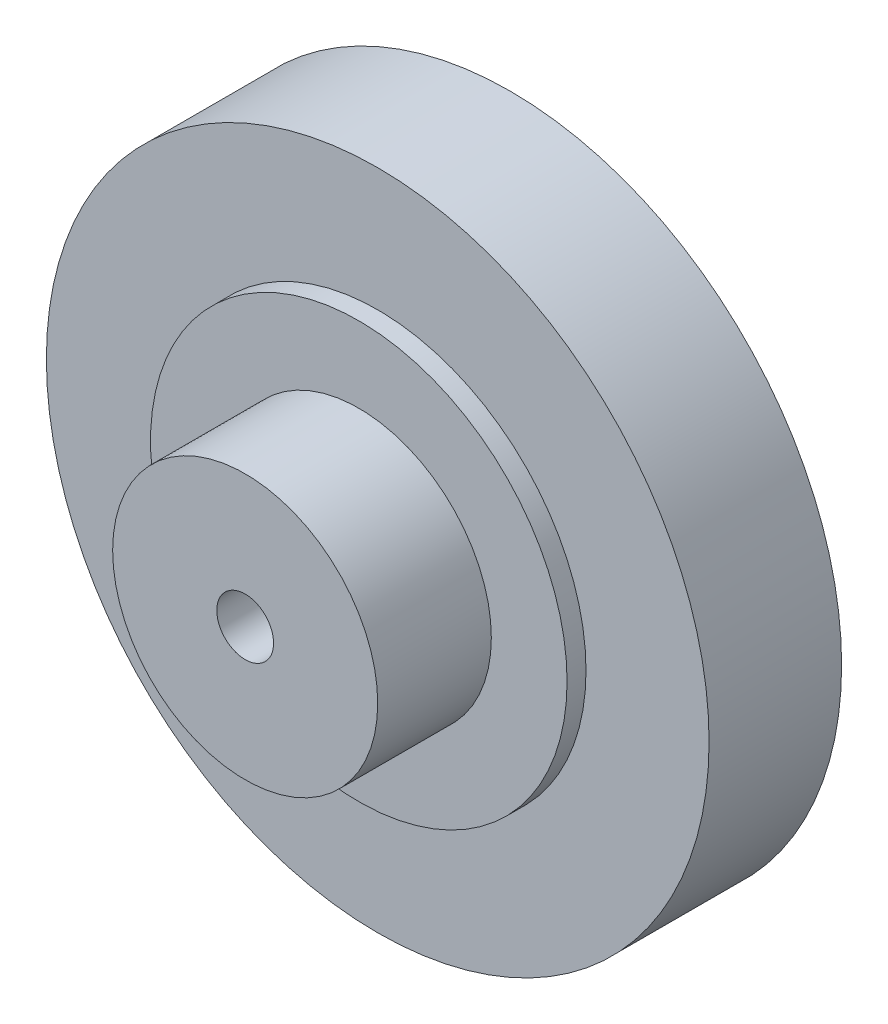
ISO-10303-21;
HEADER;
FILE_DESCRIPTION(('STEP AP214'),'2;1');
FILE_NAME('part.step','',(''),(''),'','','');
FILE_SCHEMA(('AUTOMOTIVE_DESIGN { 1 0 10303 214 1 1 1 1 }'));
ENDSEC;
DATA;
#1=APPLICATION_CONTEXT('core data for automotive mechanical design processes');
#2=APPLICATION_PROTOCOL_DEFINITION('international standard','automotive_design',2000,#1);
#3=PRODUCT_CONTEXT('',#1,'mechanical');
#4=PRODUCT('Part','Part','',(#3));
#5=PRODUCT_RELATED_PRODUCT_CATEGORY('part','',(#4));
#6=PRODUCT_DEFINITION_FORMATION('','',#4);
#7=PRODUCT_DEFINITION_CONTEXT('part definition',#1,'design');
#8=PRODUCT_DEFINITION('design','',#6,#7);
#9=PRODUCT_DEFINITION_SHAPE('','',#8);
#10=(LENGTH_UNIT() NAMED_UNIT(*) SI_UNIT(.MILLI.,.METRE.));
#11=(NAMED_UNIT(*) PLANE_ANGLE_UNIT() SI_UNIT($,.RADIAN.));
#12=(NAMED_UNIT(*) SI_UNIT($,.STERADIAN.) SOLID_ANGLE_UNIT());
#13=UNCERTAINTY_MEASURE_WITH_UNIT(LENGTH_MEASURE(1.E-05),#10,'distance_accuracy_value','');
#14=(GEOMETRIC_REPRESENTATION_CONTEXT(3) GLOBAL_UNCERTAINTY_ASSIGNED_CONTEXT((#13)) GLOBAL_UNIT_ASSIGNED_CONTEXT((#10,
#11,#12)) REPRESENTATION_CONTEXT('',''));
#15=CARTESIAN_POINT('',(0.,0.,0.));
#16=DIRECTION('',(0.,0.,1.));
#17=DIRECTION('',(1.,0.,0.));
#18=AXIS2_PLACEMENT_3D('',#15,#16,#17);
#19=CARTESIAN_POINT('',(0.,0.,-7.));
#20=DIRECTION('',(0.,0.,1.));
#21=DIRECTION('',(1.,0.,0.));
#22=AXIS2_PLACEMENT_3D('',#19,#20,#21);
#23=CYLINDRICAL_SURFACE('',#22,35.);
#24=CARTESIAN_POINT('',(0.,0.,-7.));
#25=DIRECTION('',(0.,0.,1.));
#26=DIRECTION('',(1.,0.,0.));
#27=AXIS2_PLACEMENT_3D('',#24,#25,#26);
#28=CIRCLE('',#27,35.);
#29=CARTESIAN_POINT('',(35.,0.,-7.));
#30=VERTEX_POINT('',#29);
#31=EDGE_CURVE('E77',#30,#30,#28,.T.);
#32=ORIENTED_EDGE('',*,*,#31,.T.);
#33=EDGE_LOOP('',(#32));
#34=FACE_BOUND('',#33,.T.);
#35=CARTESIAN_POINT('',(0.,0.,7.));
#36=DIRECTION('',(0.,0.,1.));
#37=DIRECTION('',(1.,0.,0.));
#38=AXIS2_PLACEMENT_3D('',#35,#36,#37);
#39=CIRCLE('',#38,35.);
#40=CARTESIAN_POINT('',(35.,0.,7.));
#41=VERTEX_POINT('',#40);
#42=EDGE_CURVE('E73',#41,#41,#39,.T.);
#43=ORIENTED_EDGE('',*,*,#42,.F.);
#44=EDGE_LOOP('',(#43));
#45=FACE_BOUND('',#44,.T.);
#46=ADVANCED_FACE('F45',(#34,#45),#23,.T.);
#47=CARTESIAN_POINT('',(0.,0.,-7.));
#48=DIRECTION('',(0.,0.,1.));
#49=DIRECTION('',(1.,0.,0.));
#50=AXIS2_PLACEMENT_3D('',#47,#48,#49);
#51=PLANE('',#50);
#52=CARTESIAN_POINT('',(0.,0.,-7.));
#53=DIRECTION('',(0.,0.,-1.));
#54=DIRECTION('',(-1.,0.,0.));
#55=AXIS2_PLACEMENT_3D('',#52,#53,#54);
#56=CIRCLE('',#55,22.);
#57=CARTESIAN_POINT('',(-22.,0.,-7.));
#58=VERTEX_POINT('',#57);
#59=EDGE_CURVE('E53',#58,#58,#56,.T.);
#60=ORIENTED_EDGE('',*,*,#59,.F.);
#61=EDGE_LOOP('',(#60));
#62=FACE_BOUND('',#61,.T.);
#63=ORIENTED_EDGE('',*,*,#31,.F.);
#64=EDGE_LOOP('',(#63));
#65=FACE_BOUND('',#64,.T.);
#66=ADVANCED_FACE('F86',(#62,#65),#51,.F.);
#67=CARTESIAN_POINT('',(0.,0.,7.));
#68=DIRECTION('',(0.,0.,1.));
#69=DIRECTION('',(1.,0.,0.));
#70=AXIS2_PLACEMENT_3D('',#67,#68,#69);
#71=PLANE('',#70);
#72=CARTESIAN_POINT('',(0.,0.,7.));
#73=DIRECTION('',(0.,0.,1.));
#74=DIRECTION('',(1.,0.,0.));
#75=AXIS2_PLACEMENT_3D('',#72,#73,#74);
#76=CIRCLE('',#75,22.);
#77=CARTESIAN_POINT('',(22.,0.,7.));
#78=VERTEX_POINT('',#77);
#79=EDGE_CURVE('E59',#78,#78,#76,.T.);
#80=ORIENTED_EDGE('',*,*,#79,.F.);
#81=EDGE_LOOP('',(#80));
#82=FACE_BOUND('',#81,.T.);
#83=ORIENTED_EDGE('',*,*,#42,.T.);
#84=EDGE_LOOP('',(#83));
#85=FACE_BOUND('',#84,.T.);
#86=ADVANCED_FACE('F88',(#82,#85),#71,.T.);
#87=CARTESIAN_POINT('',(0.,0.,9.));
#88=DIRECTION('',(0.,0.,-1.));
#89=DIRECTION('',(-1.,0.,0.));
#90=AXIS2_PLACEMENT_3D('',#87,#88,#89);
#91=CYLINDRICAL_SURFACE('',#90,22.);
#92=CARTESIAN_POINT('',(0.,0.,9.));
#93=DIRECTION('',(0.,0.,1.));
#94=DIRECTION('',(1.,0.,0.));
#95=AXIS2_PLACEMENT_3D('',#92,#93,#94);
#96=CIRCLE('',#95,22.);
#97=CARTESIAN_POINT('',(22.,0.,9.));
#98=VERTEX_POINT('',#97);
#99=EDGE_CURVE('E68',#98,#98,#96,.T.);
#100=ORIENTED_EDGE('',*,*,#99,.F.);
#101=EDGE_LOOP('',(#100));
#102=FACE_BOUND('',#101,.T.);
#103=ORIENTED_EDGE('',*,*,#79,.T.);
#104=EDGE_LOOP('',(#103));
#105=FACE_BOUND('',#104,.T.);
#106=ADVANCED_FACE('F95',(#102,#105),#91,.T.);
#107=CARTESIAN_POINT('',(0.,0.,9.));
#108=DIRECTION('',(0.,0.,1.));
#109=DIRECTION('',(1.,0.,0.));
#110=AXIS2_PLACEMENT_3D('',#107,#108,#109);
#111=PLANE('',#110);
#112=CARTESIAN_POINT('',(0.,0.,9.));
#113=DIRECTION('',(0.,0.,1.));
#114=DIRECTION('',(1.,0.,0.));
#115=AXIS2_PLACEMENT_3D('',#112,#113,#114);
#116=CIRCLE('',#115,14.);
#117=CARTESIAN_POINT('',(14.,0.,9.));
#118=VERTEX_POINT('',#117);
#119=EDGE_CURVE('E10',#118,#118,#116,.T.);
#120=ORIENTED_EDGE('',*,*,#119,.F.);
#121=EDGE_LOOP('',(#120));
#122=FACE_BOUND('',#121,.T.);
#123=ORIENTED_EDGE('',*,*,#99,.T.);
#124=EDGE_LOOP('',(#123));
#125=FACE_BOUND('',#124,.T.);
#126=ADVANCED_FACE('F102',(#122,#125),#111,.T.);
#127=CARTESIAN_POINT('',(0.,0.,-9.));
#128=DIRECTION('',(0.,0.,1.));
#129=DIRECTION('',(1.,0.,0.));
#130=AXIS2_PLACEMENT_3D('',#127,#128,#129);
#131=CYLINDRICAL_SURFACE('',#130,22.);
#132=CARTESIAN_POINT('',(0.,0.,-9.));
#133=DIRECTION('',(0.,0.,-1.));
#134=DIRECTION('',(-1.,0.,0.));
#135=AXIS2_PLACEMENT_3D('',#132,#133,#134);
#136=CIRCLE('',#135,22.);
#137=CARTESIAN_POINT('',(-22.,0.,-9.));
#138=VERTEX_POINT('',#137);
#139=EDGE_CURVE('E65',#138,#138,#136,.T.);
#140=ORIENTED_EDGE('',*,*,#139,.F.);
#141=EDGE_LOOP('',(#140));
#142=FACE_BOUND('',#141,.T.);
#143=ORIENTED_EDGE('',*,*,#59,.T.);
#144=EDGE_LOOP('',(#143));
#145=FACE_BOUND('',#144,.T.);
#146=ADVANCED_FACE('F106',(#142,#145),#131,.T.);
#147=CARTESIAN_POINT('',(0.,0.,-9.));
#148=DIRECTION('',(0.,0.,-1.));
#149=DIRECTION('',(-1.,0.,0.));
#150=AXIS2_PLACEMENT_3D('',#147,#148,#149);
#151=PLANE('',#150);
#152=CARTESIAN_POINT('',(0.,0.,-9.));
#153=DIRECTION('',(0.,0.,-1.));
#154=DIRECTION('',(-1.,0.,0.));
#155=AXIS2_PLACEMENT_3D('',#152,#153,#154);
#156=CIRCLE('',#155,3.);
#157=CARTESIAN_POINT('',(-3.,0.,-9.));
#158=VERTEX_POINT('',#157);
#159=EDGE_CURVE('E132',#158,#158,#156,.T.);
#160=ORIENTED_EDGE('',*,*,#159,.F.);
#161=EDGE_LOOP('',(#160));
#162=FACE_BOUND('',#161,.T.);
#163=ORIENTED_EDGE('',*,*,#139,.T.);
#164=EDGE_LOOP('',(#163));
#165=FACE_BOUND('',#164,.T.);
#166=ADVANCED_FACE('F109',(#162,#165),#151,.T.);
#167=CARTESIAN_POINT('',(0.,0.,21.));
#168=DIRECTION('',(0.,0.,-1.));
#169=DIRECTION('',(-1.,0.,0.));
#170=AXIS2_PLACEMENT_3D('',#167,#168,#169);
#171=CYLINDRICAL_SURFACE('',#170,14.);
#172=CARTESIAN_POINT('',(0.,0.,21.));
#173=DIRECTION('',(0.,0.,1.));
#174=DIRECTION('',(1.,0.,0.));
#175=AXIS2_PLACEMENT_3D('',#172,#173,#174);
#176=CIRCLE('',#175,14.);
#177=CARTESIAN_POINT('',(14.,0.,21.));
#178=VERTEX_POINT('',#177);
#179=EDGE_CURVE('E63',#178,#178,#176,.T.);
#180=ORIENTED_EDGE('',*,*,#179,.F.);
#181=EDGE_LOOP('',(#180));
#182=FACE_BOUND('',#181,.T.);
#183=ORIENTED_EDGE('',*,*,#119,.T.);
#184=EDGE_LOOP('',(#183));
#185=FACE_BOUND('',#184,.T.);
#186=ADVANCED_FACE('F113',(#182,#185),#171,.T.);
#187=CARTESIAN_POINT('',(0.,0.,21.));
#188=DIRECTION('',(0.,0.,1.));
#189=DIRECTION('',(1.,0.,0.));
#190=AXIS2_PLACEMENT_3D('',#187,#188,#189);
#191=PLANE('',#190);
#192=CARTESIAN_POINT('',(0.,0.,21.));
#193=DIRECTION('',(0.,0.,1.));
#194=DIRECTION('',(1.,0.,0.));
#195=AXIS2_PLACEMENT_3D('',#192,#193,#194);
#196=CIRCLE('',#195,3.);
#197=CARTESIAN_POINT('',(-3.,0.,21.));
#198=VERTEX_POINT('',#197);
#199=EDGE_CURVE('E48',#198,#198,#196,.T.);
#200=ORIENTED_EDGE('',*,*,#199,.F.);
#201=EDGE_LOOP('',(#200));
#202=FACE_BOUND('',#201,.T.);
#203=ORIENTED_EDGE('',*,*,#179,.T.);
#204=EDGE_LOOP('',(#203));
#205=FACE_BOUND('',#204,.T.);
#206=ADVANCED_FACE('F117',(#202,#205),#191,.T.);
#207=CARTESIAN_POINT('',(0.,0.,50.));
#208=DIRECTION('',(0.,0.,-1.));
#209=DIRECTION('',(-1.,0.,0.));
#210=AXIS2_PLACEMENT_3D('',#207,#208,#209);
#211=CYLINDRICAL_SURFACE('',#210,3.);
#212=CARTESIAN_POINT('',(-3.,0.,21.));
#213=CARTESIAN_POINT('',(-3.,0.,20.6875));
#214=CARTESIAN_POINT('',(-3.,0.,20.375));
#215=CARTESIAN_POINT('',(-3.,0.,19.75));
#216=CARTESIAN_POINT('',(-3.,0.,19.4375));
#217=CARTESIAN_POINT('',(-3.,0.,18.8125));
#218=CARTESIAN_POINT('',(-3.,0.,18.5));
#219=CARTESIAN_POINT('',(-3.,0.,17.875));
#220=CARTESIAN_POINT('',(-3.,0.,17.5625));
#221=CARTESIAN_POINT('',(-3.,0.,16.9375));
#222=CARTESIAN_POINT('',(-3.,0.,16.625));
#223=CARTESIAN_POINT('',(-3.,0.,16.));
#224=CARTESIAN_POINT('',(-3.,0.,15.6875));
#225=CARTESIAN_POINT('',(-3.,0.,15.0625));
#226=CARTESIAN_POINT('',(-3.,0.,14.75));
#227=CARTESIAN_POINT('',(-3.,0.,14.125));
#228=CARTESIAN_POINT('',(-3.,0.,13.8125));
#229=CARTESIAN_POINT('',(-3.,0.,13.1875));
#230=CARTESIAN_POINT('',(-3.,0.,12.875));
#231=CARTESIAN_POINT('',(-3.,0.,12.25));
#232=CARTESIAN_POINT('',(-3.,0.,11.9375));
#233=CARTESIAN_POINT('',(-3.,0.,11.3125));
#234=CARTESIAN_POINT('',(-3.,0.,11.));
#235=CARTESIAN_POINT('',(-3.,0.,10.375));
#236=CARTESIAN_POINT('',(-3.,0.,10.0625));
#237=CARTESIAN_POINT('',(-3.,0.,9.4375));
#238=CARTESIAN_POINT('',(-3.,0.,9.125));
#239=CARTESIAN_POINT('',(-3.,0.,8.5));
#240=CARTESIAN_POINT('',(-3.,0.,8.1875));
#241=CARTESIAN_POINT('',(-3.,0.,7.5625));
#242=CARTESIAN_POINT('',(-3.,0.,7.25));
#243=CARTESIAN_POINT('',(-3.,0.,6.625));
#244=CARTESIAN_POINT('',(-3.,0.,6.3125));
#245=CARTESIAN_POINT('',(-3.,0.,5.6875));
#246=CARTESIAN_POINT('',(-3.,0.,5.375));
#247=CARTESIAN_POINT('',(-3.,0.,4.75));
#248=CARTESIAN_POINT('',(-3.,0.,4.4375));
#249=CARTESIAN_POINT('',(-3.,0.,3.8125));
#250=CARTESIAN_POINT('',(-3.,0.,3.5));
#251=CARTESIAN_POINT('',(-3.,0.,2.875));
#252=CARTESIAN_POINT('',(-3.,0.,2.5625));
#253=CARTESIAN_POINT('',(-3.,0.,1.9375));
#254=CARTESIAN_POINT('',(-3.,0.,1.625));
#255=CARTESIAN_POINT('',(-3.,0.,1.));
#256=CARTESIAN_POINT('',(-3.,0.,0.687500000000001));
#257=CARTESIAN_POINT('',(-3.,0.,0.0625));
#258=CARTESIAN_POINT('',(-3.,0.,-0.25));
#259=CARTESIAN_POINT('',(-3.,0.,-0.875000000000001));
#260=CARTESIAN_POINT('',(-3.,0.,-1.1875));
#261=CARTESIAN_POINT('',(-3.,0.,-1.8125));
#262=CARTESIAN_POINT('',(-3.,0.,-2.125));
#263=CARTESIAN_POINT('',(-3.,0.,-2.75));
#264=CARTESIAN_POINT('',(-3.,0.,-3.0625));
#265=CARTESIAN_POINT('',(-3.,0.,-3.6875));
#266=CARTESIAN_POINT('',(-3.,0.,-4.));
#267=CARTESIAN_POINT('',(-3.,0.,-4.625));
#268=CARTESIAN_POINT('',(-3.,0.,-4.9375));
#269=CARTESIAN_POINT('',(-3.,0.,-5.5625));
#270=CARTESIAN_POINT('',(-3.,0.,-5.875));
#271=CARTESIAN_POINT('',(-3.,0.,-6.5));
#272=CARTESIAN_POINT('',(-3.,0.,-6.8125));
#273=CARTESIAN_POINT('',(-3.,0.,-7.4375));
#274=CARTESIAN_POINT('',(-3.,0.,-7.75));
#275=CARTESIAN_POINT('',(-3.,0.,-8.375));
#276=CARTESIAN_POINT('',(-3.,0.,-8.6875));
#277=CARTESIAN_POINT('',(-3.,0.,-9.));
#278=B_SPLINE_CURVE_WITH_KNOTS('',3,(#212,#213,#214,#215,#216,#217,#218,#219,#220,#221,#222,
#223,#224,#225,#226,#227,#228,#229,#230,#231,#232,#233,#234,#235,#236,#237,#238,#239,#240,#241,
#242,#243,#244,#245,#246,#247,#248,#249,#250,#251,#252,#253,#254,#255,#256,#257,#258,#259,#260,
#261,#262,#263,#264,#265,#266,#267,#268,#269,#270,#271,#272,#273,#274,#275,#276,#277),
.UNSPECIFIED.,.F.,.F.,(4,2,2,2,2,2,2,2,2,2,2,2,2,2,2,2,2,2,2,2,2,2,2,2,2,2,2,2,2,2,2,2,4),(0.,
0.937500000000001,1.875,2.8125,3.75,4.6875,5.62499999999999,6.5625,7.5,8.4375,9.375,10.3125,
11.25,12.1875,13.125,14.0625,15.,15.9375,16.875,17.8125,18.75,19.6875,20.625,21.5625,22.5,
23.4375,24.375,25.3125,26.25,27.1875,28.125,29.0625,30.),.UNSPECIFIED.);
#279=EDGE_CURVE('BSEAM121',#198,#158,#278,.T.);
#280=ORIENTED_EDGE('',*,*,#199,.T.);
#281=ORIENTED_EDGE('',*,*,#159,.T.);
#282=ORIENTED_EDGE('',*,*,#279,.T.);
#283=ORIENTED_EDGE('',*,*,#279,.F.);
#284=EDGE_LOOP('',(#280,#282,#281,#283));
#285=FACE_BOUND('',#284,.T.);
#286=ADVANCED_FACE('F121',(#285),#211,.F.);
#287=CLOSED_SHELL('',(#46,#66,#86,#106,#126,#146,#166,#186,#206,#286));
#288=MANIFOLD_SOLID_BREP('B2',#287);
#289=ADVANCED_BREP_SHAPE_REPRESENTATION('',(#18,#288),#14);
#290=SHAPE_DEFINITION_REPRESENTATION(#9,#289);
ENDSEC;
END-ISO-10303-21;
